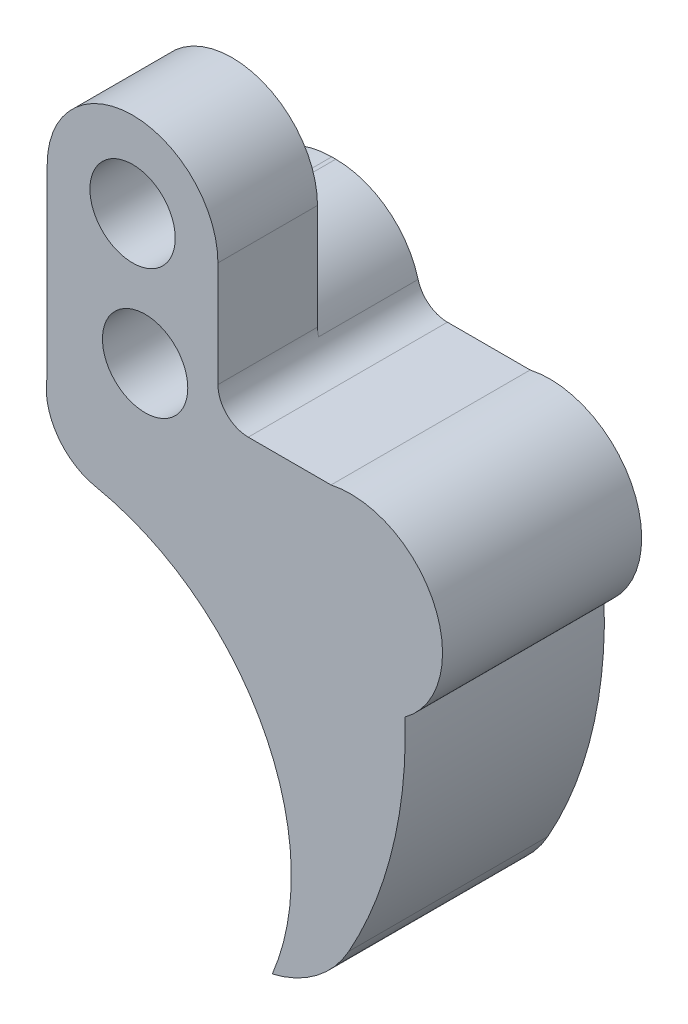
ISO-10303-21;
HEADER;
FILE_DESCRIPTION(('STEP AP214'),'2;1');
FILE_NAME('part.step','',(''),(''),'','','');
FILE_SCHEMA(('AUTOMOTIVE_DESIGN { 1 0 10303 214 1 1 1 1 }'));
ENDSEC;
DATA;
#1=APPLICATION_CONTEXT('core data for automotive mechanical design processes');
#2=APPLICATION_PROTOCOL_DEFINITION('international standard','automotive_design',2000,#1);
#3=PRODUCT_CONTEXT('',#1,'mechanical');
#4=PRODUCT('Part','Part','',(#3));
#5=PRODUCT_RELATED_PRODUCT_CATEGORY('part','',(#4));
#6=PRODUCT_DEFINITION_FORMATION('','',#4);
#7=PRODUCT_DEFINITION_CONTEXT('part definition',#1,'design');
#8=PRODUCT_DEFINITION('design','',#6,#7);
#9=PRODUCT_DEFINITION_SHAPE('','',#8);
#10=(LENGTH_UNIT() NAMED_UNIT(*) SI_UNIT(.MILLI.,.METRE.));
#11=(NAMED_UNIT(*) PLANE_ANGLE_UNIT() SI_UNIT($,.RADIAN.));
#12=(NAMED_UNIT(*) SI_UNIT($,.STERADIAN.) SOLID_ANGLE_UNIT());
#13=UNCERTAINTY_MEASURE_WITH_UNIT(LENGTH_MEASURE(1.E-05),#10,'distance_accuracy_value','');
#14=(GEOMETRIC_REPRESENTATION_CONTEXT(3) GLOBAL_UNCERTAINTY_ASSIGNED_CONTEXT((#13)) GLOBAL_UNIT_ASSIGNED_CONTEXT((#10,
#11,#12)) REPRESENTATION_CONTEXT('',''));
#15=CARTESIAN_POINT('',(0.,0.,0.));
#16=DIRECTION('',(0.,0.,1.));
#17=DIRECTION('',(1.,0.,0.));
#18=AXIS2_PLACEMENT_3D('',#15,#16,#17);
#19=CARTESIAN_POINT('',(-4.37933198895735,12.9923240668504,-3.5));
#20=DIRECTION('',(0.,0.,1.));
#21=DIRECTION('',(1.,0.,0.));
#22=AXIS2_PLACEMENT_3D('',#19,#20,#21);
#23=CYLINDRICAL_SURFACE('',#22,3.);
#24=CARTESIAN_POINT('',(-4.37933198895735,12.9923240668504,0.));
#25=DIRECTION('',(0.,0.,1.));
#26=DIRECTION('',(1.,0.,0.));
#27=AXIS2_PLACEMENT_3D('',#24,#25,#26);
#28=CIRCLE('',#27,3.);
#29=CARTESIAN_POINT('',(-7.37933198895735,12.9923240668504,0.));
#30=VERTEX_POINT('',#29);
#31=CARTESIAN_POINT('',(-1.37933198895735,12.9923240668504,0.));
#32=VERTEX_POINT('',#31);
#33=EDGE_CURVE('E132',#30,#32,#28,.F.);
#34=ORIENTED_EDGE('',*,*,#33,.F.);
#35=DIRECTION('',(0.,0.,1.));
#36=VECTOR('',#35,1.);
#37=CARTESIAN_POINT('',(-7.37933198895735,12.9923240668504,-3.5));
#38=LINE('',#37,#36);
#39=CARTESIAN_POINT('',(-7.37933198895735,12.9923240668504,3.5));
#40=VERTEX_POINT('',#39);
#41=EDGE_CURVE('E142',#30,#40,#38,.T.);
#42=ORIENTED_EDGE('',*,*,#41,.T.);
#43=CARTESIAN_POINT('',(-4.37933198895735,12.9923240668504,3.5));
#44=DIRECTION('',(0.,0.,1.));
#45=DIRECTION('',(1.,0.,0.));
#46=AXIS2_PLACEMENT_3D('',#43,#44,#45);
#47=CIRCLE('',#46,3.);
#48=CARTESIAN_POINT('',(-1.37933198895735,12.9923240668504,3.5));
#49=VERTEX_POINT('',#48);
#50=EDGE_CURVE('E204',#49,#40,#47,.T.);
#51=ORIENTED_EDGE('',*,*,#50,.F.);
#52=DIRECTION('',(0.,0.,1.));
#53=VECTOR('',#52,1.);
#54=CARTESIAN_POINT('',(-1.37933198895735,12.9923240668504,-3.5));
#55=LINE('',#54,#53);
#56=EDGE_CURVE('E144',#32,#49,#55,.T.);
#57=ORIENTED_EDGE('',*,*,#56,.F.);
#58=EDGE_LOOP('',(#34,#42,#51,#57));
#59=FACE_BOUND('',#58,.T.);
#60=ADVANCED_FACE('F32',(#59),#23,.T.);
#61=CARTESIAN_POINT('',(-1.37933198895735,12.9923240668504,-3.5));
#62=DIRECTION('',(1.,0.,0.));
#63=DIRECTION('',(0.,1.,0.));
#64=AXIS2_PLACEMENT_3D('',#61,#62,#63);
#65=PLANE('',#64);
#66=DIRECTION('',(0.,0.,1.));
#67=VECTOR('',#66,1.);
#68=CARTESIAN_POINT('',(-1.37933198895735,9.28822628803201,-3.5));
#69=LINE('',#68,#67);
#70=CARTESIAN_POINT('',(-1.37933198895735,9.28822628803201,0.));
#71=VERTEX_POINT('',#70);
#72=CARTESIAN_POINT('',(-1.37933198895735,9.28822628803201,3.5));
#73=VERTEX_POINT('',#72);
#74=EDGE_CURVE('E251',#71,#73,#69,.T.);
#75=ORIENTED_EDGE('',*,*,#74,.F.);
#76=DIRECTION('',(0.,-1.,0.));
#77=VECTOR('',#76,1.);
#78=CARTESIAN_POINT('',(-1.37933198895735,12.9923240668504,0.));
#79=LINE('',#78,#77);
#80=EDGE_CURVE('E51',#32,#71,#79,.T.);
#81=ORIENTED_EDGE('',*,*,#80,.F.);
#82=ORIENTED_EDGE('',*,*,#56,.T.);
#83=DIRECTION('',(0.,1.,0.));
#84=VECTOR('',#83,1.);
#85=CARTESIAN_POINT('',(-1.37933198895735,12.9923240668504,3.5));
#86=LINE('',#85,#84);
#87=EDGE_CURVE('E228',#73,#49,#86,.T.);
#88=ORIENTED_EDGE('',*,*,#87,.F.);
#89=EDGE_LOOP('',(#75,#81,#82,#88));
#90=FACE_BOUND('',#89,.T.);
#91=ADVANCED_FACE('F304',(#90),#65,.T.);
#92=CARTESIAN_POINT('',(-0.313161908793722,9.28822628803201,-3.5));
#93=DIRECTION('',(0.,0.,1.));
#94=DIRECTION('',(1.,0.,0.));
#95=AXIS2_PLACEMENT_3D('',#92,#93,#94);
#96=CYLINDRICAL_SURFACE('',#95,1.06617008016363);
#97=CARTESIAN_POINT('',(-0.313161908793722,9.28822628803201,-3.5));
#98=DIRECTION('',(0.,0.,-1.));
#99=DIRECTION('',(-1.,0.,0.));
#100=AXIS2_PLACEMENT_3D('',#97,#98,#99);
#101=CIRCLE('',#100,1.06617008016363);
#102=CARTESIAN_POINT('',(-0.313161908793722,8.22205620786838,-3.5));
#103=VERTEX_POINT('',#102);
#104=CARTESIAN_POINT('',(-1.3419878726789,9.00851969913598,-3.5));
#105=VERTEX_POINT('',#104);
#106=EDGE_CURVE('E151',#103,#105,#101,.T.);
#107=ORIENTED_EDGE('',*,*,#106,.T.);
#108=DIRECTION('',(0.,0.,1.));
#109=VECTOR('',#108,1.);
#110=CARTESIAN_POINT('',(-1.3419878726789,9.00851969913598,-3.5));
#111=LINE('',#110,#109);
#112=CARTESIAN_POINT('',(-1.3419878726789,9.00851969913598,0.));
#113=VERTEX_POINT('',#112);
#114=EDGE_CURVE('E179',#105,#113,#111,.T.);
#115=ORIENTED_EDGE('',*,*,#114,.T.);
#116=CARTESIAN_POINT('',(-0.313161908793722,9.28822628803201,0.));
#117=DIRECTION('',(0.,0.,1.));
#118=DIRECTION('',(1.,0.,0.));
#119=AXIS2_PLACEMENT_3D('',#116,#117,#118);
#120=CIRCLE('',#119,1.06617008016363);
#121=EDGE_CURVE('E46',#113,#71,#120,.F.);
#122=ORIENTED_EDGE('',*,*,#121,.T.);
#123=ORIENTED_EDGE('',*,*,#74,.T.);
#124=CARTESIAN_POINT('',(-0.313161908793722,9.28822628803201,3.5));
#125=DIRECTION('',(0.,0.,-1.));
#126=DIRECTION('',(-1.,0.,0.));
#127=AXIS2_PLACEMENT_3D('',#124,#125,#126);
#128=CIRCLE('',#127,1.06617008016363);
#129=CARTESIAN_POINT('',(-0.313161908793722,8.22205620786838,3.5));
#130=VERTEX_POINT('',#129);
#131=EDGE_CURVE('E225',#130,#73,#128,.T.);
#132=ORIENTED_EDGE('',*,*,#131,.F.);
#133=DIRECTION('',(0.,0.,1.));
#134=VECTOR('',#133,1.);
#135=CARTESIAN_POINT('',(-0.313161908793722,8.22205620786838,-3.5));
#136=LINE('',#135,#134);
#137=EDGE_CURVE('E253',#103,#130,#136,.T.);
#138=ORIENTED_EDGE('',*,*,#137,.F.);
#139=EDGE_LOOP('',(#107,#115,#122,#123,#132,#138));
#140=FACE_BOUND('',#139,.T.);
#141=ADVANCED_FACE('F183',(#140),#96,.F.);
#142=CARTESIAN_POINT('',(-0.313161908793722,8.22205620786838,-3.5));
#143=DIRECTION('',(0.,1.,0.));
#144=DIRECTION('',(-1.,0.,0.));
#145=AXIS2_PLACEMENT_3D('',#142,#143,#144);
#146=PLANE('',#145);
#147=ORIENTED_EDGE('',*,*,#137,.T.);
#148=DIRECTION('',(-1.,0.,0.));
#149=VECTOR('',#148,1.);
#150=CARTESIAN_POINT('',(-0.313161908793722,8.22205620786838,3.5));
#151=LINE('',#150,#149);
#152=CARTESIAN_POINT('',(2.59629286525103,8.22205620786839,3.5));
#153=VERTEX_POINT('',#152);
#154=EDGE_CURVE('E222',#153,#130,#151,.T.);
#155=ORIENTED_EDGE('',*,*,#154,.F.);
#156=DIRECTION('',(0.,0.,1.));
#157=VECTOR('',#156,1.);
#158=CARTESIAN_POINT('',(2.59629286525103,8.22205620786839,-3.5));
#159=LINE('',#158,#157);
#160=CARTESIAN_POINT('',(2.59629286525103,8.22205620786839,-3.5));
#161=VERTEX_POINT('',#160);
#162=EDGE_CURVE('E255',#161,#153,#159,.T.);
#163=ORIENTED_EDGE('',*,*,#162,.F.);
#164=DIRECTION('',(-1.,0.,0.));
#165=VECTOR('',#164,1.);
#166=CARTESIAN_POINT('',(-0.313161908793722,8.22205620786838,-3.5));
#167=LINE('',#166,#165);
#168=EDGE_CURVE('E156',#161,#103,#167,.T.);
#169=ORIENTED_EDGE('',*,*,#168,.T.);
#170=EDGE_LOOP('',(#147,#155,#163,#169));
#171=FACE_BOUND('',#170,.T.);
#172=ADVANCED_FACE('F291',(#171),#146,.T.);
#173=CARTESIAN_POINT('',(3.28310423770903,5.06306676775198,-3.5));
#174=DIRECTION('',(0.,0.,1.));
#175=DIRECTION('',(1.,0.,0.));
#176=AXIS2_PLACEMENT_3D('',#173,#174,#175);
#177=CYLINDRICAL_SURFACE('',#176,3.23278891115777);
#178=ORIENTED_EDGE('',*,*,#162,.T.);
#179=CARTESIAN_POINT('',(3.28310423770903,5.06306676775198,3.5));
#180=DIRECTION('',(0.,0.,1.));
#181=DIRECTION('',(-1.,0.,0.));
#182=AXIS2_PLACEMENT_3D('',#179,#180,#181);
#183=CIRCLE('',#182,3.23278891115777);
#184=CARTESIAN_POINT('',(5.19642182958435,2.45727707233812,3.5));
#185=VERTEX_POINT('',#184);
#186=EDGE_CURVE('E219',#185,#153,#183,.T.);
#187=ORIENTED_EDGE('',*,*,#186,.F.);
#188=DIRECTION('',(0.,0.,1.));
#189=VECTOR('',#188,1.);
#190=CARTESIAN_POINT('',(5.19642182958435,2.45727707233812,-3.5));
#191=LINE('',#190,#189);
#192=CARTESIAN_POINT('',(5.19642182958435,2.45727707233812,-3.5));
#193=VERTEX_POINT('',#192);
#194=EDGE_CURVE('E257',#193,#185,#191,.T.);
#195=ORIENTED_EDGE('',*,*,#194,.F.);
#196=CARTESIAN_POINT('',(3.28310423770903,5.06306676775198,-3.5));
#197=DIRECTION('',(0.,0.,1.));
#198=DIRECTION('',(-1.,0.,0.));
#199=AXIS2_PLACEMENT_3D('',#196,#197,#198);
#200=CIRCLE('',#199,3.23278891115777);
#201=EDGE_CURVE('E245',#193,#161,#200,.T.);
#202=ORIENTED_EDGE('',*,*,#201,.T.);
#203=EDGE_LOOP('',(#178,#187,#195,#202));
#204=FACE_BOUND('',#203,.T.);
#205=ADVANCED_FACE('F289',(#204),#177,.T.);
#206=CARTESIAN_POINT('',(-10.3613026765806,1.94119433740522,-3.5));
#207=DIRECTION('',(0.,0.,1.));
#208=DIRECTION('',(1.,0.,0.));
#209=AXIS2_PLACEMENT_3D('',#206,#207,#208);
#210=CYLINDRICAL_SURFACE('',#209,15.5662819324019);
#211=ORIENTED_EDGE('',*,*,#194,.T.);
#212=CARTESIAN_POINT('',(-10.3613026765806,1.94119433740522,3.5));
#213=DIRECTION('',(0.,0.,1.));
#214=DIRECTION('',(1.,0.,0.));
#215=AXIS2_PLACEMENT_3D('',#212,#213,#214);
#216=CIRCLE('',#215,15.5662819324019);
#217=CARTESIAN_POINT('',(3.21878440817067,-5.66737766853605,3.5));
#218=VERTEX_POINT('',#217);
#219=EDGE_CURVE('E216',#218,#185,#216,.T.);
#220=ORIENTED_EDGE('',*,*,#219,.F.);
#221=DIRECTION('',(0.,0.,1.));
#222=VECTOR('',#221,1.);
#223=CARTESIAN_POINT('',(3.21878440817067,-5.66737766853605,-3.5));
#224=LINE('',#223,#222);
#225=CARTESIAN_POINT('',(3.21878440817067,-5.66737766853605,-3.5));
#226=VERTEX_POINT('',#225);
#227=EDGE_CURVE('E259',#226,#218,#224,.T.);
#228=ORIENTED_EDGE('',*,*,#227,.F.);
#229=CARTESIAN_POINT('',(-10.3613026765806,1.94119433740522,-3.5));
#230=DIRECTION('',(0.,0.,1.));
#231=DIRECTION('',(1.,0.,0.));
#232=AXIS2_PLACEMENT_3D('',#229,#230,#231);
#233=CIRCLE('',#232,15.5662819324019);
#234=EDGE_CURVE('E242',#226,#193,#233,.T.);
#235=ORIENTED_EDGE('',*,*,#234,.T.);
#236=EDGE_LOOP('',(#211,#220,#228,#235));
#237=FACE_BOUND('',#236,.T.);
#238=ADVANCED_FACE('F284',(#237),#210,.T.);
#239=CARTESIAN_POINT('',(-0.441733921235159,-3.61648380353088,-3.5));
#240=DIRECTION('',(0.,0.,1.));
#241=DIRECTION('',(1.,0.,0.));
#242=AXIS2_PLACEMENT_3D('',#239,#240,#241);
#243=CYLINDRICAL_SURFACE('',#242,4.195898007034);
#244=ORIENTED_EDGE('',*,*,#227,.T.);
#245=CARTESIAN_POINT('',(-0.441733921235159,-3.61648380353088,3.5));
#246=DIRECTION('',(0.,0.,1.));
#247=DIRECTION('',(-1.,0.,0.));
#248=AXIS2_PLACEMENT_3D('',#245,#246,#247);
#249=CIRCLE('',#248,4.195898007034);
#250=CARTESIAN_POINT('',(0.531658524717058,-7.69791336087902,3.5));
#251=VERTEX_POINT('',#250);
#252=EDGE_CURVE('E213',#251,#218,#249,.T.);
#253=ORIENTED_EDGE('',*,*,#252,.F.);
#254=DIRECTION('',(0.,0.,1.));
#255=VECTOR('',#254,1.);
#256=CARTESIAN_POINT('',(0.531658524717058,-7.69791336087902,-3.5));
#257=LINE('',#256,#255);
#258=CARTESIAN_POINT('',(0.531658524717058,-7.69791336087902,-3.5));
#259=VERTEX_POINT('',#258);
#260=EDGE_CURVE('E261',#259,#251,#257,.T.);
#261=ORIENTED_EDGE('',*,*,#260,.F.);
#262=CARTESIAN_POINT('',(-0.441733921235159,-3.61648380353088,-3.5));
#263=DIRECTION('',(0.,0.,1.));
#264=DIRECTION('',(-1.,0.,0.));
#265=AXIS2_PLACEMENT_3D('',#262,#263,#264);
#266=CIRCLE('',#265,4.195898007034);
#267=EDGE_CURVE('E239',#259,#226,#266,.T.);
#268=ORIENTED_EDGE('',*,*,#267,.T.);
#269=EDGE_LOOP('',(#244,#253,#261,#268));
#270=FACE_BOUND('',#269,.T.);
#271=ADVANCED_FACE('F276',(#270),#243,.T.);
#272=CARTESIAN_POINT('',(-7.37933198895735,-4.37697186605527,-3.5));
#273=DIRECTION('',(0.,0.,1.));
#274=DIRECTION('',(1.,0.,0.));
#275=AXIS2_PLACEMENT_3D('',#272,#273,#274);
#276=CYLINDRICAL_SURFACE('',#275,8.57976825558177);
#277=ORIENTED_EDGE('',*,*,#260,.T.);
#278=CARTESIAN_POINT('',(-7.37933198895735,-4.37697186605527,3.5));
#279=DIRECTION('',(0.,0.,-1.));
#280=DIRECTION('',(1.,0.,0.));
#281=AXIS2_PLACEMENT_3D('',#278,#279,#280);
#282=CIRCLE('',#281,8.57976825558177);
#283=CARTESIAN_POINT('',(-5.65258793408075,4.02724007132689,3.5));
#284=VERTEX_POINT('',#283);
#285=EDGE_CURVE('E210',#284,#251,#282,.T.);
#286=ORIENTED_EDGE('',*,*,#285,.F.);
#287=DIRECTION('',(0.,0.,1.));
#288=VECTOR('',#287,1.);
#289=CARTESIAN_POINT('',(-5.65258793408075,4.02724007132689,-3.5));
#290=LINE('',#289,#288);
#291=CARTESIAN_POINT('',(-5.65258793408075,4.02724007132689,-3.5));
#292=VERTEX_POINT('',#291);
#293=EDGE_CURVE('E153',#292,#284,#290,.T.);
#294=ORIENTED_EDGE('',*,*,#293,.F.);
#295=CARTESIAN_POINT('',(-7.37933198895735,-4.37697186605527,-3.5));
#296=DIRECTION('',(0.,0.,-1.));
#297=DIRECTION('',(1.,0.,0.));
#298=AXIS2_PLACEMENT_3D('',#295,#296,#297);
#299=CIRCLE('',#298,8.57976825558177);
#300=EDGE_CURVE('E236',#292,#259,#299,.T.);
#301=ORIENTED_EDGE('',*,*,#300,.T.);
#302=EDGE_LOOP('',(#277,#286,#294,#301));
#303=FACE_BOUND('',#302,.T.);
#304=ADVANCED_FACE('F273',(#303),#276,.F.);
#305=CARTESIAN_POINT('',(-5.23891451563645,6.16334470486841,-3.5));
#306=DIRECTION('',(0.,0.,1.));
#307=DIRECTION('',(1.,0.,0.));
#308=AXIS2_PLACEMENT_3D('',#305,#306,#307);
#309=CYLINDRICAL_SURFACE('',#308,2.17579151174116);
#310=ORIENTED_EDGE('',*,*,#293,.T.);
#311=CARTESIAN_POINT('',(-5.23891451563645,6.16334470486841,3.5));
#312=DIRECTION('',(0.,0.,1.));
#313=DIRECTION('',(1.,0.,0.));
#314=AXIS2_PLACEMENT_3D('',#311,#312,#313);
#315=CIRCLE('',#314,2.17579151174116);
#316=CARTESIAN_POINT('',(-7.37933198895735,6.55408981676041,3.5));
#317=VERTEX_POINT('',#316);
#318=EDGE_CURVE('E207',#317,#284,#315,.T.);
#319=ORIENTED_EDGE('',*,*,#318,.F.);
#320=DIRECTION('',(0.,0.,1.));
#321=VECTOR('',#320,1.);
#322=CARTESIAN_POINT('',(-7.37933198895735,6.55408981676041,-3.5));
#323=LINE('',#322,#321);
#324=CARTESIAN_POINT('',(-7.37933198895735,6.55408981676041,-3.5));
#325=VERTEX_POINT('',#324);
#326=EDGE_CURVE('E150',#325,#317,#323,.T.);
#327=ORIENTED_EDGE('',*,*,#326,.F.);
#328=CARTESIAN_POINT('',(-5.23891451563645,6.16334470486841,-3.5));
#329=DIRECTION('',(0.,0.,1.));
#330=DIRECTION('',(1.,0.,0.));
#331=AXIS2_PLACEMENT_3D('',#328,#329,#330);
#332=CIRCLE('',#331,2.17579151174116);
#333=EDGE_CURVE('E233',#325,#292,#332,.T.);
#334=ORIENTED_EDGE('',*,*,#333,.T.);
#335=EDGE_LOOP('',(#310,#319,#327,#334));
#336=FACE_BOUND('',#335,.T.);
#337=ADVANCED_FACE('F264',(#336),#309,.T.);
#338=CARTESIAN_POINT('',(-7.37933198895735,6.55408981676041,-3.5));
#339=DIRECTION('',(-1.,0.,0.));
#340=DIRECTION('',(0.,-1.,0.));
#341=AXIS2_PLACEMENT_3D('',#338,#339,#340);
#342=PLANE('',#341);
#343=DIRECTION('',(0.,1.,0.));
#344=VECTOR('',#343,1.);
#345=CARTESIAN_POINT('',(-7.37933198895735,6.55408981676041,0.));
#346=LINE('',#345,#344);
#347=CARTESIAN_POINT('',(-7.37933198895735,8.22147851096145,0.));
#348=VERTEX_POINT('',#347);
#349=EDGE_CURVE('E128',#348,#30,#346,.T.);
#350=ORIENTED_EDGE('',*,*,#349,.F.);
#351=DIRECTION('',(0.,0.,1.));
#352=VECTOR('',#351,1.);
#353=CARTESIAN_POINT('',(-7.37933198895735,8.22147851096145,-3.5));
#354=LINE('',#353,#352);
#355=CARTESIAN_POINT('',(-7.37933198895735,8.22147851096145,-3.5));
#356=VERTEX_POINT('',#355);
#357=EDGE_CURVE('E172',#348,#356,#354,.F.);
#358=ORIENTED_EDGE('',*,*,#357,.T.);
#359=DIRECTION('',(0.,-1.,0.));
#360=VECTOR('',#359,1.);
#361=CARTESIAN_POINT('',(-7.37933198895735,6.55408981676041,-3.5));
#362=LINE('',#361,#360);
#363=EDGE_CURVE('E231',#356,#325,#362,.T.);
#364=ORIENTED_EDGE('',*,*,#363,.T.);
#365=ORIENTED_EDGE('',*,*,#326,.T.);
#366=DIRECTION('',(0.,-1.,0.));
#367=VECTOR('',#366,1.);
#368=CARTESIAN_POINT('',(-7.37933198895735,6.55408981676041,3.5));
#369=LINE('',#368,#367);
#370=EDGE_CURVE('E148',#40,#317,#369,.T.);
#371=ORIENTED_EDGE('',*,*,#370,.F.);
#372=ORIENTED_EDGE('',*,*,#41,.F.);
#373=EDGE_LOOP('',(#350,#358,#364,#365,#371,#372));
#374=FACE_BOUND('',#373,.T.);
#375=ADVANCED_FACE('F146',(#374),#342,.T.);
#376=CARTESIAN_POINT('',(-4.37933198895735,12.9923240668504,-3.5));
#377=DIRECTION('',(0.,0.,1.));
#378=DIRECTION('',(1.,0.,0.));
#379=AXIS2_PLACEMENT_3D('',#376,#377,#378);
#380=PLANE('',#379);
#381=CARTESIAN_POINT('',(-3.93856552289762,8.65169205497907,-3.5));
#382=DIRECTION('',(0.,0.,1.));
#383=DIRECTION('',(1.,0.,0.));
#384=AXIS2_PLACEMENT_3D('',#381,#382,#383);
#385=CIRCLE('',#384,1.5);
#386=CARTESIAN_POINT('',(-2.43856552289762,8.65169205497907,-3.5));
#387=VERTEX_POINT('',#386);
#388=EDGE_CURVE('E193',#387,#387,#385,.T.);
#389=ORIENTED_EDGE('',*,*,#388,.T.);
#390=EDGE_LOOP('',(#389));
#391=FACE_BOUND('',#390,.T.);
#392=ORIENTED_EDGE('',*,*,#363,.F.);
#393=CARTESIAN_POINT('',(-4.37933198895735,8.22147851096145,-3.5));
#394=DIRECTION('',(0.,0.,1.));
#395=DIRECTION('',(1.,0.,0.));
#396=AXIS2_PLACEMENT_3D('',#393,#394,#395);
#397=CIRCLE('',#396,3.);
#398=CARTESIAN_POINT('',(-4.37933198895735,11.2214785109614,-3.5));
#399=VERTEX_POINT('',#398);
#400=EDGE_CURVE('E176',#356,#399,#397,.F.);
#401=ORIENTED_EDGE('',*,*,#400,.T.);
#402=DIRECTION('',(1.,0.,0.));
#403=VECTOR('',#402,1.);
#404=CARTESIAN_POINT('',(-4.37933198895735,11.2214785109614,-3.5));
#405=LINE('',#404,#403);
#406=CARTESIAN_POINT('',(-4.23690862601859,11.2214785109614,-3.5));
#407=VERTEX_POINT('',#406);
#408=EDGE_CURVE('E163',#399,#407,#405,.T.);
#409=ORIENTED_EDGE('',*,*,#408,.T.);
#410=CARTESIAN_POINT('',(-4.23690862601859,8.22147851096145,-3.5));
#411=DIRECTION('',(0.,0.,1.));
#412=DIRECTION('',(1.,0.,0.));
#413=AXIS2_PLACEMENT_3D('',#410,#411,#412);
#414=CIRCLE('',#413,3.);
#415=EDGE_CURVE('E174',#407,#105,#414,.F.);
#416=ORIENTED_EDGE('',*,*,#415,.T.);
#417=ORIENTED_EDGE('',*,*,#106,.F.);
#418=ORIENTED_EDGE('',*,*,#168,.F.);
#419=ORIENTED_EDGE('',*,*,#201,.F.);
#420=ORIENTED_EDGE('',*,*,#234,.F.);
#421=ORIENTED_EDGE('',*,*,#267,.F.);
#422=ORIENTED_EDGE('',*,*,#300,.F.);
#423=ORIENTED_EDGE('',*,*,#333,.F.);
#424=EDGE_LOOP('',(#392,#401,#409,#416,#417,#418,#419,#420,#421,#422,#423));
#425=FACE_BOUND('',#424,.T.);
#426=ADVANCED_FACE('F280',(#391,#425),#380,.F.);
#427=CARTESIAN_POINT('',(-4.37933198895735,12.9923240668504,3.5));
#428=DIRECTION('',(0.,0.,1.));
#429=DIRECTION('',(1.,0.,0.));
#430=AXIS2_PLACEMENT_3D('',#427,#428,#429);
#431=PLANE('',#430);
#432=CARTESIAN_POINT('',(-3.93856552289762,8.65169205497907,3.5));
#433=DIRECTION('',(0.,0.,1.));
#434=DIRECTION('',(1.,0.,0.));
#435=AXIS2_PLACEMENT_3D('',#432,#433,#434);
#436=CIRCLE('',#435,1.5);
#437=CARTESIAN_POINT('',(-2.43856552289762,8.65169205497907,3.5));
#438=VERTEX_POINT('',#437);
#439=EDGE_CURVE('E196',#438,#438,#436,.T.);
#440=ORIENTED_EDGE('',*,*,#439,.F.);
#441=EDGE_LOOP('',(#440));
#442=FACE_BOUND('',#441,.T.);
#443=CARTESIAN_POINT('',(-4.37933198895735,12.9923240668504,3.5));
#444=DIRECTION('',(0.,0.,1.));
#445=DIRECTION('',(1.,0.,0.));
#446=AXIS2_PLACEMENT_3D('',#443,#444,#445);
#447=CIRCLE('',#446,1.5);
#448=CARTESIAN_POINT('',(-2.87933198895735,12.9923240668504,3.5));
#449=VERTEX_POINT('',#448);
#450=EDGE_CURVE('E201',#449,#449,#447,.T.);
#451=ORIENTED_EDGE('',*,*,#450,.F.);
#452=EDGE_LOOP('',(#451));
#453=FACE_BOUND('',#452,.T.);
#454=ORIENTED_EDGE('',*,*,#50,.T.);
#455=ORIENTED_EDGE('',*,*,#370,.T.);
#456=ORIENTED_EDGE('',*,*,#318,.T.);
#457=ORIENTED_EDGE('',*,*,#285,.T.);
#458=ORIENTED_EDGE('',*,*,#252,.T.);
#459=ORIENTED_EDGE('',*,*,#219,.T.);
#460=ORIENTED_EDGE('',*,*,#186,.T.);
#461=ORIENTED_EDGE('',*,*,#154,.T.);
#462=ORIENTED_EDGE('',*,*,#131,.T.);
#463=ORIENTED_EDGE('',*,*,#87,.T.);
#464=EDGE_LOOP('',(#454,#455,#456,#457,#458,#459,#460,#461,#462,#463));
#465=FACE_BOUND('',#464,.T.);
#466=ADVANCED_FACE('F271',(#442,#453,#465),#431,.T.);
#467=CARTESIAN_POINT('',(-4.37933198895735,12.9923240668504,-3.5));
#468=DIRECTION('',(0.,0.,1.));
#469=DIRECTION('',(1.,0.,0.));
#470=AXIS2_PLACEMENT_3D('',#467,#468,#469);
#471=CYLINDRICAL_SURFACE('',#470,1.5);
#472=CARTESIAN_POINT('',(-4.37933198895735,12.9923240668504,0.));
#473=DIRECTION('',(0.,0.,1.));
#474=DIRECTION('',(1.,0.,0.));
#475=AXIS2_PLACEMENT_3D('',#472,#473,#474);
#476=CIRCLE('',#475,1.5);
#477=CARTESIAN_POINT('',(-2.87933198895735,12.9923240668504,0.));
#478=VERTEX_POINT('',#477);
#479=EDGE_CURVE('E137',#478,#478,#476,.F.);
#480=ORIENTED_EDGE('',*,*,#479,.T.);
#481=EDGE_LOOP('',(#480));
#482=FACE_BOUND('',#481,.T.);
#483=ORIENTED_EDGE('',*,*,#450,.T.);
#484=EDGE_LOOP('',(#483));
#485=FACE_BOUND('',#484,.T.);
#486=ADVANCED_FACE('F332',(#482,#485),#471,.F.);
#487=CARTESIAN_POINT('',(-7.41470602737761,18.1036469599007,0.));
#488=DIRECTION('',(0.,0.,1.));
#489=DIRECTION('',(1.,0.,0.));
#490=AXIS2_PLACEMENT_3D('',#487,#488,#489);
#491=PLANE('',#490);
#492=ORIENTED_EDGE('',*,*,#80,.T.);
#493=ORIENTED_EDGE('',*,*,#121,.F.);
#494=CARTESIAN_POINT('',(-4.23690862601859,8.22147851096145,0.));
#495=DIRECTION('',(0.,0.,1.));
#496=DIRECTION('',(1.,0.,0.));
#497=AXIS2_PLACEMENT_3D('',#494,#495,#496);
#498=CIRCLE('',#497,3.);
#499=CARTESIAN_POINT('',(-4.23690862601859,11.2214785109614,0.));
#500=VERTEX_POINT('',#499);
#501=EDGE_CURVE('E11',#113,#500,#498,.T.);
#502=ORIENTED_EDGE('',*,*,#501,.T.);
#503=DIRECTION('',(1.,0.,0.));
#504=VECTOR('',#503,1.);
#505=CARTESIAN_POINT('',(-7.41470602737761,11.2214785109614,0.));
#506=LINE('',#505,#504);
#507=CARTESIAN_POINT('',(-4.37933198895735,11.2214785109614,0.));
#508=VERTEX_POINT('',#507);
#509=EDGE_CURVE('E162',#508,#500,#506,.T.);
#510=ORIENTED_EDGE('',*,*,#509,.F.);
#511=CARTESIAN_POINT('',(-4.37933198895735,8.22147851096145,0.));
#512=DIRECTION('',(0.,0.,1.));
#513=DIRECTION('',(1.,0.,0.));
#514=AXIS2_PLACEMENT_3D('',#511,#512,#513);
#515=CIRCLE('',#514,3.);
#516=EDGE_CURVE('E40',#508,#348,#515,.T.);
#517=ORIENTED_EDGE('',*,*,#516,.T.);
#518=ORIENTED_EDGE('',*,*,#349,.T.);
#519=ORIENTED_EDGE('',*,*,#33,.T.);
#520=EDGE_LOOP('',(#492,#493,#502,#510,#517,#518,#519));
#521=FACE_BOUND('',#520,.T.);
#522=ORIENTED_EDGE('',*,*,#479,.F.);
#523=EDGE_LOOP('',(#522));
#524=FACE_BOUND('',#523,.T.);
#525=ADVANCED_FACE('F130',(#521,#524),#491,.F.);
#526=CARTESIAN_POINT('',(-7.41470602737761,11.2214785109614,0.));
#527=DIRECTION('',(0.,-1.,0.));
#528=DIRECTION('',(0.,0.,-1.));
#529=AXIS2_PLACEMENT_3D('',#526,#527,#528);
#530=PLANE('',#529);
#531=ORIENTED_EDGE('',*,*,#408,.F.);
#532=DIRECTION('',(0.,0.,1.));
#533=VECTOR('',#532,1.);
#534=CARTESIAN_POINT('',(-4.37933198895735,11.2214785109614,0.));
#535=LINE('',#534,#533);
#536=EDGE_CURVE('E169',#399,#508,#535,.T.);
#537=ORIENTED_EDGE('',*,*,#536,.T.);
#538=ORIENTED_EDGE('',*,*,#509,.T.);
#539=DIRECTION('',(0.,0.,-1.));
#540=VECTOR('',#539,1.);
#541=CARTESIAN_POINT('',(-4.23690862601859,11.2214785109614,-3.5));
#542=LINE('',#541,#540);
#543=EDGE_CURVE('E166',#500,#407,#542,.T.);
#544=ORIENTED_EDGE('',*,*,#543,.T.);
#545=EDGE_LOOP('',(#531,#537,#538,#544));
#546=FACE_BOUND('',#545,.T.);
#547=ADVANCED_FACE('F191',(#546),#530,.F.);
#548=CARTESIAN_POINT('',(-4.37933198895735,8.22147851096145,0.));
#549=DIRECTION('',(0.,0.,-1.));
#550=DIRECTION('',(-1.,0.,0.));
#551=AXIS2_PLACEMENT_3D('',#548,#549,#550);
#552=CYLINDRICAL_SURFACE('',#551,3.);
#553=ORIENTED_EDGE('',*,*,#400,.F.);
#554=ORIENTED_EDGE('',*,*,#357,.F.);
#555=ORIENTED_EDGE('',*,*,#516,.F.);
#556=ORIENTED_EDGE('',*,*,#536,.F.);
#557=EDGE_LOOP('',(#553,#554,#555,#556));
#558=FACE_BOUND('',#557,.T.);
#559=ADVANCED_FACE('F294',(#558),#552,.T.);
#560=CARTESIAN_POINT('',(-4.23690862601859,8.22147851096145,-3.5));
#561=DIRECTION('',(0.,0.,1.));
#562=DIRECTION('',(1.,0.,0.));
#563=AXIS2_PLACEMENT_3D('',#560,#561,#562);
#564=CYLINDRICAL_SURFACE('',#563,3.);
#565=ORIENTED_EDGE('',*,*,#501,.F.);
#566=ORIENTED_EDGE('',*,*,#114,.F.);
#567=ORIENTED_EDGE('',*,*,#415,.F.);
#568=ORIENTED_EDGE('',*,*,#543,.F.);
#569=EDGE_LOOP('',(#565,#566,#567,#568));
#570=FACE_BOUND('',#569,.T.);
#571=ADVANCED_FACE('F34',(#570),#564,.T.);
#572=CARTESIAN_POINT('',(-3.93856552289762,8.65169205497907,-3.5));
#573=DIRECTION('',(0.,0.,1.));
#574=DIRECTION('',(1.,0.,0.));
#575=AXIS2_PLACEMENT_3D('',#572,#573,#574);
#576=CYLINDRICAL_SURFACE('',#575,1.5);
#577=ORIENTED_EDGE('',*,*,#388,.F.);
#578=EDGE_LOOP('',(#577));
#579=FACE_BOUND('',#578,.T.);
#580=ORIENTED_EDGE('',*,*,#439,.T.);
#581=EDGE_LOOP('',(#580));
#582=FACE_BOUND('',#581,.T.);
#583=ADVANCED_FACE('F300',(#579,#582),#576,.F.);
#584=CLOSED_SHELL('',(#60,#91,#141,#172,#205,#238,#271,#304,#337,#375,#426,#466,#486,#525,#547,
#559,#571,#583));
#585=MANIFOLD_SOLID_BREP('B2',#584);
#586=ADVANCED_BREP_SHAPE_REPRESENTATION('',(#18,#585),#14);
#587=SHAPE_DEFINITION_REPRESENTATION(#9,#586);
ENDSEC;
END-ISO-10303-21;
